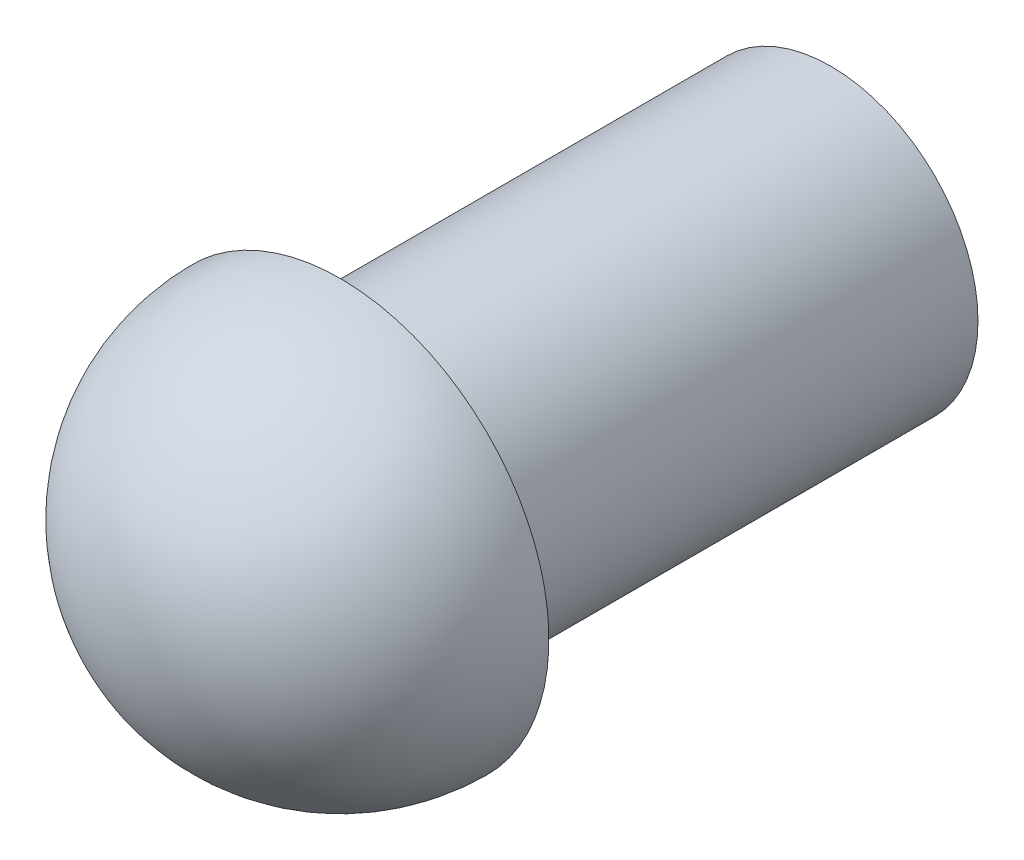
ISO-10303-21;
HEADER;
FILE_DESCRIPTION(('STEP AP214'),'2;1');
FILE_NAME('part.step','',(''),(''),'','','');
FILE_SCHEMA(('AUTOMOTIVE_DESIGN { 1 0 10303 214 1 1 1 1 }'));
ENDSEC;
DATA;
#1=APPLICATION_CONTEXT('core data for automotive mechanical design processes');
#2=APPLICATION_PROTOCOL_DEFINITION('international standard','automotive_design',2000,#1);
#3=PRODUCT_CONTEXT('',#1,'mechanical');
#4=PRODUCT('Part','Part','',(#3));
#5=PRODUCT_RELATED_PRODUCT_CATEGORY('part','',(#4));
#6=PRODUCT_DEFINITION_FORMATION('','',#4);
#7=PRODUCT_DEFINITION_CONTEXT('part definition',#1,'design');
#8=PRODUCT_DEFINITION('design','',#6,#7);
#9=PRODUCT_DEFINITION_SHAPE('','',#8);
#10=(LENGTH_UNIT() NAMED_UNIT(*) SI_UNIT(.MILLI.,.METRE.));
#11=(NAMED_UNIT(*) PLANE_ANGLE_UNIT() SI_UNIT($,.RADIAN.));
#12=(NAMED_UNIT(*) SI_UNIT($,.STERADIAN.) SOLID_ANGLE_UNIT());
#13=UNCERTAINTY_MEASURE_WITH_UNIT(LENGTH_MEASURE(1.E-05),#10,'distance_accuracy_value','');
#14=(GEOMETRIC_REPRESENTATION_CONTEXT(3) GLOBAL_UNCERTAINTY_ASSIGNED_CONTEXT((#13)) GLOBAL_UNIT_ASSIGNED_CONTEXT((#10,
#11,#12)) REPRESENTATION_CONTEXT('',''));
#15=CARTESIAN_POINT('',(0.,0.,0.));
#16=DIRECTION('',(0.,0.,1.));
#17=DIRECTION('',(1.,0.,0.));
#18=AXIS2_PLACEMENT_3D('',#15,#16,#17);
#19=CARTESIAN_POINT('',(0.,0.,10.));
#20=DIRECTION('',(0.,0.,-1.));
#21=DIRECTION('',(-1.,0.,0.));
#22=AXIS2_PLACEMENT_3D('',#19,#20,#21);
#23=CYLINDRICAL_SURFACE('',#22,3.);
#24=CARTESIAN_POINT('',(0.,0.,10.));
#25=DIRECTION('',(0.,0.,1.));
#26=DIRECTION('',(1.,0.,0.));
#27=AXIS2_PLACEMENT_3D('',#24,#25,#26);
#28=CIRCLE('',#27,3.);
#29=CARTESIAN_POINT('',(3.,0.,10.));
#30=VERTEX_POINT('',#29);
#31=EDGE_CURVE('E10',#30,#30,#28,.T.);
#32=ORIENTED_EDGE('',*,*,#31,.F.);
#33=EDGE_LOOP('',(#32));
#34=FACE_BOUND('',#33,.T.);
#35=CARTESIAN_POINT('',(0.,0.,0.));
#36=DIRECTION('',(0.,0.,1.));
#37=DIRECTION('',(1.,0.,0.));
#38=AXIS2_PLACEMENT_3D('',#35,#36,#37);
#39=CIRCLE('',#38,3.);
#40=CARTESIAN_POINT('',(3.,0.,0.));
#41=VERTEX_POINT('',#40);
#42=EDGE_CURVE('E40',#41,#41,#39,.T.);
#43=ORIENTED_EDGE('',*,*,#42,.T.);
#44=EDGE_LOOP('',(#43));
#45=FACE_BOUND('',#44,.T.);
#46=ADVANCED_FACE('F37',(#34,#45),#23,.T.);
#47=CARTESIAN_POINT('',(0.,0.,0.));
#48=DIRECTION('',(0.,0.,1.));
#49=DIRECTION('',(1.,0.,0.));
#50=AXIS2_PLACEMENT_3D('',#47,#48,#49);
#51=PLANE('',#50);
#52=ORIENTED_EDGE('',*,*,#42,.F.);
#53=EDGE_LOOP('',(#52));
#54=FACE_BOUND('',#53,.T.);
#55=ADVANCED_FACE('F56',(#54),#51,.F.);
#56=CARTESIAN_POINT('',(0.,0.,10.));
#57=DIRECTION('',(0.,-1.,0.));
#58=DIRECTION('',(1.,0.,0.));
#59=AXIS2_PLACEMENT_3D('',#56,#57,#58);
#60=SPHERICAL_SURFACE('',#59,4.25);
#61=CARTESIAN_POINT('',(0.,0.,10.));
#62=DIRECTION('',(0.,0.,-1.));
#63=DIRECTION('',(-1.,0.,0.));
#64=AXIS2_PLACEMENT_3D('',#61,#62,#63);
#65=SPHERICAL_SURFACE('',#64,4.25);
#66=CARTESIAN_POINT('',(0.,0.,10.));
#67=DIRECTION('',(0.,0.,-1.));
#68=DIRECTION('',(-1.,0.,0.));
#69=AXIS2_PLACEMENT_3D('',#66,#67,#68);
#70=CIRCLE('',#69,4.25);
#71=CARTESIAN_POINT('',(-4.25,0.,10.));
#72=VERTEX_POINT('',#71);
#73=EDGE_CURVE('E47',#72,#72,#70,.T.);
#74=ORIENTED_EDGE('',*,*,#73,.F.);
#75=EDGE_LOOP('',(#74));
#76=FACE_BOUND('',#75,.T.);
#77=ADVANCED_FACE('F54',(#76),#65,.T.);
#78=CARTESIAN_POINT('',(0.,0.,10.));
#79=DIRECTION('',(0.,0.,-1.));
#80=DIRECTION('',(-1.,0.,0.));
#81=AXIS2_PLACEMENT_3D('',#78,#79,#80);
#82=PLANE('',#81);
#83=ORIENTED_EDGE('',*,*,#31,.T.);
#84=EDGE_LOOP('',(#83));
#85=FACE_BOUND('',#84,.T.);
#86=ORIENTED_EDGE('',*,*,#73,.T.);
#87=EDGE_LOOP('',(#86));
#88=FACE_BOUND('',#87,.T.);
#89=ADVANCED_FACE('F52',(#85,#88),#82,.T.);
#90=CLOSED_SHELL('',(#46,#55,#77,#89));
#91=MANIFOLD_SOLID_BREP('B2',#90);
#92=ADVANCED_BREP_SHAPE_REPRESENTATION('',(#18,#91),#14);
#93=SHAPE_DEFINITION_REPRESENTATION(#9,#92);
ENDSEC;
END-ISO-10303-21;
